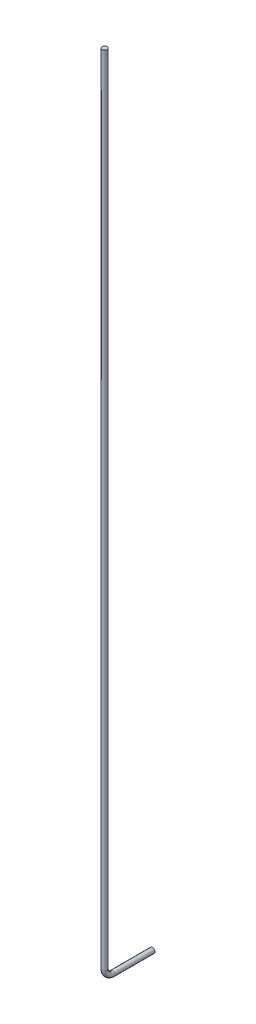
ISO-10303-21;
HEADER;
FILE_DESCRIPTION(('STEP AP214'),'2;1');
FILE_NAME('part.step','',(''),(''),'','','');
FILE_SCHEMA(('AUTOMOTIVE_DESIGN { 1 0 10303 214 1 1 1 1 }'));
ENDSEC;
DATA;
#1=APPLICATION_CONTEXT('core data for automotive mechanical design processes');
#2=APPLICATION_PROTOCOL_DEFINITION('international standard','automotive_design',2000,#1);
#3=PRODUCT_CONTEXT('',#1,'mechanical');
#4=PRODUCT('Part','Part','',(#3));
#5=PRODUCT_RELATED_PRODUCT_CATEGORY('part','',(#4));
#6=PRODUCT_DEFINITION_FORMATION('','',#4);
#7=PRODUCT_DEFINITION_CONTEXT('part definition',#1,'design');
#8=PRODUCT_DEFINITION('design','',#6,#7);
#9=PRODUCT_DEFINITION_SHAPE('','',#8);
#10=(LENGTH_UNIT() NAMED_UNIT(*) SI_UNIT(.MILLI.,.METRE.));
#11=(NAMED_UNIT(*) PLANE_ANGLE_UNIT() SI_UNIT($,.RADIAN.));
#12=(NAMED_UNIT(*) SI_UNIT($,.STERADIAN.) SOLID_ANGLE_UNIT());
#13=UNCERTAINTY_MEASURE_WITH_UNIT(LENGTH_MEASURE(1.E-05),#10,'distance_accuracy_value','');
#14=(GEOMETRIC_REPRESENTATION_CONTEXT(3) GLOBAL_UNCERTAINTY_ASSIGNED_CONTEXT((#13)) GLOBAL_UNIT_ASSIGNED_CONTEXT((#10,
#11,#12)) REPRESENTATION_CONTEXT('',''));
#15=CARTESIAN_POINT('',(0.,0.,0.));
#16=DIRECTION('',(0.,0.,1.));
#17=DIRECTION('',(1.,0.,0.));
#18=AXIS2_PLACEMENT_3D('',#15,#16,#17);
#19=CARTESIAN_POINT('',(0.,0.,20.));
#20=DIRECTION('',(0.,0.,-1.));
#21=DIRECTION('',(-1.,0.,0.));
#22=AXIS2_PLACEMENT_3D('',#19,#20,#21);
#23=CYLINDRICAL_SURFACE('',#22,1.6);
#24=CARTESIAN_POINT('',(0.,0.,0.));
#25=DIRECTION('',(0.,0.,1.));
#26=DIRECTION('',(1.,0.,0.));
#27=AXIS2_PLACEMENT_3D('',#24,#25,#26);
#28=CIRCLE('',#27,1.6);
#29=CARTESIAN_POINT('',(1.6,0.,0.));
#30=VERTEX_POINT('',#29);
#31=EDGE_CURVE('E10',#30,#30,#28,.T.);
#32=ORIENTED_EDGE('',*,*,#31,.T.);
#33=EDGE_LOOP('',(#32));
#34=FACE_BOUND('',#33,.T.);
#35=CARTESIAN_POINT('',(0.,0.,25.));
#36=DIRECTION('',(0.,0.,1.));
#37=DIRECTION('',(1.,0.,0.));
#38=AXIS2_PLACEMENT_3D('',#35,#36,#37);
#39=CIRCLE('',#38,1.6);
#40=CARTESIAN_POINT('',(0.,-1.59999999999984,25.));
#41=VERTEX_POINT('',#40);
#42=EDGE_CURVE('E51',#41,#41,#39,.T.);
#43=ORIENTED_EDGE('',*,*,#42,.F.);
#44=EDGE_LOOP('',(#43));
#45=FACE_BOUND('',#44,.T.);
#46=ADVANCED_FACE('F37',(#34,#45),#23,.T.);
#47=CARTESIAN_POINT('',(0.,0.,0.));
#48=DIRECTION('',(0.,0.,1.));
#49=DIRECTION('',(1.,0.,0.));
#50=AXIS2_PLACEMENT_3D('',#47,#48,#49);
#51=PLANE('',#50);
#52=ORIENTED_EDGE('',*,*,#31,.F.);
#53=EDGE_LOOP('',(#52));
#54=FACE_BOUND('',#53,.T.);
#55=ADVANCED_FACE('F60',(#54),#51,.F.);
#56=CARTESIAN_POINT('',(0.,505.,30.));
#57=DIRECTION('',(0.,1.,0.));
#58=DIRECTION('',(1.,0.,0.));
#59=AXIS2_PLACEMENT_3D('',#56,#57,#58);
#60=PLANE('',#59);
#61=CARTESIAN_POINT('',(0.,505.,30.));
#62=DIRECTION('',(0.,1.,0.));
#63=DIRECTION('',(1.,0.,0.));
#64=AXIS2_PLACEMENT_3D('',#61,#62,#63);
#65=CIRCLE('',#64,1.6);
#66=CARTESIAN_POINT('',(1.6,505.,30.));
#67=VERTEX_POINT('',#66);
#68=EDGE_CURVE('E43',#67,#67,#65,.T.);
#69=ORIENTED_EDGE('',*,*,#68,.T.);
#70=EDGE_LOOP('',(#69));
#71=FACE_BOUND('',#70,.T.);
#72=ADVANCED_FACE('F64',(#71),#60,.T.);
#73=CARTESIAN_POINT('',(0.,5.,25.));
#74=DIRECTION('',(-1.,0.,0.));
#75=DIRECTION('',(0.,0.,1.));
#76=AXIS2_PLACEMENT_3D('',#73,#74,#75);
#77=TOROIDAL_SURFACE('',#76,4.99999999999984,1.6);
#78=CARTESIAN_POINT('',(0.,5.,30.));
#79=DIRECTION('',(0.,1.,0.));
#80=DIRECTION('',(1.,0.,0.));
#81=AXIS2_PLACEMENT_3D('',#78,#79,#80);
#82=CIRCLE('',#81,1.6);
#83=CARTESIAN_POINT('',(0.,5.,31.5999999999998));
#84=VERTEX_POINT('',#83);
#85=EDGE_CURVE('E47',#84,#84,#82,.T.);
#86=CARTESIAN_POINT('',(0.,5.,25.));
#87=DIRECTION('',(-1.,0.,0.));
#88=DIRECTION('',(0.,0.,1.));
#89=AXIS2_PLACEMENT_3D('',#86,#87,#88);
#90=CIRCLE('',#89,6.59999999999984);
#91=EDGE_CURVE('',#41,#84,#90,.T.);
#92=ORIENTED_EDGE('',*,*,#42,.T.);
#93=ORIENTED_EDGE('',*,*,#85,.F.);
#94=ORIENTED_EDGE('',*,*,#91,.T.);
#95=ORIENTED_EDGE('',*,*,#91,.F.);
#96=EDGE_LOOP('',(#92,#94,#93,#95));
#97=FACE_BOUND('',#96,.T.);
#98=ADVANCED_FACE('F57',(#97),#77,.T.);
#99=CARTESIAN_POINT('',(0.,5.,30.));
#100=DIRECTION('',(0.,1.,0.));
#101=DIRECTION('',(0.,0.,1.));
#102=AXIS2_PLACEMENT_3D('',#99,#100,#101);
#103=CYLINDRICAL_SURFACE('',#102,1.6);
#104=ORIENTED_EDGE('',*,*,#68,.F.);
#105=EDGE_LOOP('',(#104));
#106=FACE_BOUND('',#105,.T.);
#107=ORIENTED_EDGE('',*,*,#85,.T.);
#108=EDGE_LOOP('',(#107));
#109=FACE_BOUND('',#108,.T.);
#110=ADVANCED_FACE('F66',(#106,#109),#103,.T.);
#111=CLOSED_SHELL('',(#46,#55,#72,#98,#110));
#112=MANIFOLD_SOLID_BREP('B2',#111);
#113=ADVANCED_BREP_SHAPE_REPRESENTATION('',(#18,#112),#14);
#114=SHAPE_DEFINITION_REPRESENTATION(#9,#113);
ENDSEC;
END-ISO-10303-21;
